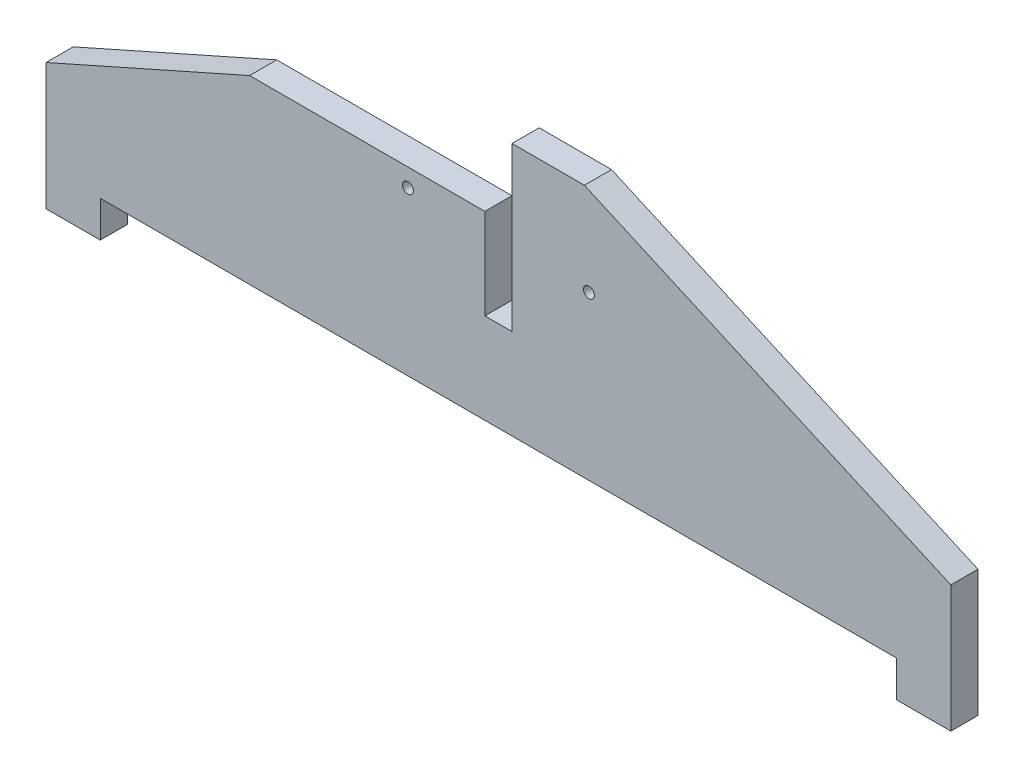
ISO-10303-21;
HEADER;
FILE_DESCRIPTION(('STEP AP214'),'2;1');
FILE_NAME('part.step','',(''),(''),'','','');
FILE_SCHEMA(('AUTOMOTIVE_DESIGN { 1 0 10303 214 1 1 1 1 }'));
ENDSEC;
DATA;
#1=APPLICATION_CONTEXT('core data for automotive mechanical design processes');
#2=APPLICATION_PROTOCOL_DEFINITION('international standard','automotive_design',2000,#1);
#3=PRODUCT_CONTEXT('',#1,'mechanical');
#4=PRODUCT('Part','Part','',(#3));
#5=PRODUCT_RELATED_PRODUCT_CATEGORY('part','',(#4));
#6=PRODUCT_DEFINITION_FORMATION('','',#4);
#7=PRODUCT_DEFINITION_CONTEXT('part definition',#1,'design');
#8=PRODUCT_DEFINITION('design','',#6,#7);
#9=PRODUCT_DEFINITION_SHAPE('','',#8);
#10=(LENGTH_UNIT() NAMED_UNIT(*) SI_UNIT(.MILLI.,.METRE.));
#11=(NAMED_UNIT(*) PLANE_ANGLE_UNIT() SI_UNIT($,.RADIAN.));
#12=(NAMED_UNIT(*) SI_UNIT($,.STERADIAN.) SOLID_ANGLE_UNIT());
#13=UNCERTAINTY_MEASURE_WITH_UNIT(LENGTH_MEASURE(1.E-05),#10,'distance_accuracy_value','');
#14=(GEOMETRIC_REPRESENTATION_CONTEXT(3) GLOBAL_UNCERTAINTY_ASSIGNED_CONTEXT((#13)) GLOBAL_UNIT_ASSIGNED_CONTEXT((#10,
#11,#12)) REPRESENTATION_CONTEXT('',''));
#15=CARTESIAN_POINT('',(0.,0.,0.));
#16=DIRECTION('',(0.,0.,1.));
#17=DIRECTION('',(1.,0.,0.));
#18=AXIS2_PLACEMENT_3D('',#15,#16,#17);
#19=CARTESIAN_POINT('',(0.,0.,15.));
#20=DIRECTION('',(0.,0.,1.));
#21=DIRECTION('',(1.,0.,0.));
#22=AXIS2_PLACEMENT_3D('',#19,#20,#21);
#23=PLANE('',#22);
#24=CARTESIAN_POINT('',(200.,110.,15.));
#25=DIRECTION('',(0.,0.,1.));
#26=DIRECTION('',(1.,0.,0.));
#27=AXIS2_PLACEMENT_3D('',#24,#25,#26);
#28=CIRCLE('',#27,2.99999999999999);
#29=CARTESIAN_POINT('',(203.,110.,15.));
#30=VERTEX_POINT('',#29);
#31=EDGE_CURVE('E182',#30,#30,#28,.T.);
#32=ORIENTED_EDGE('',*,*,#31,.F.);
#33=EDGE_LOOP('',(#32));
#34=FACE_BOUND('',#33,.T.);
#35=DIRECTION('',(0.,-1.,0.));
#36=VECTOR('',#35,1.);
#37=CARTESIAN_POINT('',(0.,70.,15.));
#38=LINE('',#37,#36);
#39=CARTESIAN_POINT('',(0.,70.,15.));
#40=VERTEX_POINT('',#39);
#41=CARTESIAN_POINT('',(0.,0.,15.));
#42=VERTEX_POINT('',#41);
#43=EDGE_CURVE('E218',#40,#42,#38,.T.);
#44=ORIENTED_EDGE('',*,*,#43,.T.);
#45=DIRECTION('',(1.,0.,0.));
#46=VECTOR('',#45,1.);
#47=CARTESIAN_POINT('',(0.,0.,15.));
#48=LINE('',#47,#46);
#49=CARTESIAN_POINT('',(30.,0.,15.));
#50=VERTEX_POINT('',#49);
#51=EDGE_CURVE('E118',#42,#50,#48,.T.);
#52=ORIENTED_EDGE('',*,*,#51,.T.);
#53=DIRECTION('',(0.,1.,0.));
#54=VECTOR('',#53,1.);
#55=CARTESIAN_POINT('',(30.,0.,15.));
#56=LINE('',#55,#54);
#57=CARTESIAN_POINT('',(30.,20.,15.));
#58=VERTEX_POINT('',#57);
#59=EDGE_CURVE('E263',#50,#58,#56,.T.);
#60=ORIENTED_EDGE('',*,*,#59,.T.);
#61=DIRECTION('',(1.,0.,0.));
#62=VECTOR('',#61,1.);
#63=CARTESIAN_POINT('',(30.,20.,15.));
#64=LINE('',#63,#62);
#65=CARTESIAN_POINT('',(470.,20.0000000000001,15.));
#66=VERTEX_POINT('',#65);
#67=EDGE_CURVE('E283',#58,#66,#64,.T.);
#68=ORIENTED_EDGE('',*,*,#67,.T.);
#69=DIRECTION('',(0.,-1.,0.));
#70=VECTOR('',#69,1.);
#71=CARTESIAN_POINT('',(470.,20.0000000000001,15.));
#72=LINE('',#71,#70);
#73=CARTESIAN_POINT('',(470.,0.,15.));
#74=VERTEX_POINT('',#73);
#75=EDGE_CURVE('E279',#66,#74,#72,.T.);
#76=ORIENTED_EDGE('',*,*,#75,.T.);
#77=DIRECTION('',(1.,0.,0.));
#78=VECTOR('',#77,1.);
#79=CARTESIAN_POINT('',(470.,0.,15.));
#80=LINE('',#79,#78);
#81=CARTESIAN_POINT('',(500.,0.,15.));
#82=VERTEX_POINT('',#81);
#83=EDGE_CURVE('E282',#74,#82,#80,.T.);
#84=ORIENTED_EDGE('',*,*,#83,.T.);
#85=DIRECTION('',(0.,1.,0.));
#86=VECTOR('',#85,1.);
#87=CARTESIAN_POINT('',(500.,0.,15.));
#88=LINE('',#87,#86);
#89=CARTESIAN_POINT('',(500.,70.0000000000001,15.));
#90=VERTEX_POINT('',#89);
#91=EDGE_CURVE('E287',#82,#90,#88,.T.);
#92=ORIENTED_EDGE('',*,*,#91,.T.);
#93=DIRECTION('',(-0.913811548620257,0.406138466053447,0.));
#94=VECTOR('',#93,1.);
#95=CARTESIAN_POINT('',(297.5,160.,15.));
#96=LINE('',#95,#94);
#97=CARTESIAN_POINT('',(297.5,160.,15.));
#98=VERTEX_POINT('',#97);
#99=EDGE_CURVE('E294',#90,#98,#96,.T.);
#100=ORIENTED_EDGE('',*,*,#99,.T.);
#101=DIRECTION('',(-1.,0.,0.));
#102=VECTOR('',#101,1.);
#103=CARTESIAN_POINT('',(257.5,160.,15.));
#104=LINE('',#103,#102);
#105=CARTESIAN_POINT('',(257.5,160.,15.));
#106=VERTEX_POINT('',#105);
#107=EDGE_CURVE('E297',#98,#106,#104,.T.);
#108=ORIENTED_EDGE('',*,*,#107,.T.);
#109=DIRECTION('',(0.,-1.,0.));
#110=VECTOR('',#109,1.);
#111=CARTESIAN_POINT('',(257.5,160.,15.));
#112=LINE('',#111,#110);
#113=CARTESIAN_POINT('',(257.5,70.,15.));
#114=VERTEX_POINT('',#113);
#115=EDGE_CURVE('E300',#106,#114,#112,.T.);
#116=ORIENTED_EDGE('',*,*,#115,.T.);
#117=DIRECTION('',(-1.,0.,0.));
#118=VECTOR('',#117,1.);
#119=CARTESIAN_POINT('',(257.5,70.,15.));
#120=LINE('',#119,#118);
#121=CARTESIAN_POINT('',(242.5,70.,15.));
#122=VERTEX_POINT('',#121);
#123=EDGE_CURVE('E155',#114,#122,#120,.T.);
#124=ORIENTED_EDGE('',*,*,#123,.T.);
#125=DIRECTION('',(0.,1.,0.));
#126=VECTOR('',#125,1.);
#127=CARTESIAN_POINT('',(242.5,70.,15.));
#128=LINE('',#127,#126);
#129=CARTESIAN_POINT('',(242.5,120.,15.));
#130=VERTEX_POINT('',#129);
#131=EDGE_CURVE('E149',#122,#130,#128,.T.);
#132=ORIENTED_EDGE('',*,*,#131,.T.);
#133=DIRECTION('',(-1.,0.,0.));
#134=VECTOR('',#133,1.);
#135=CARTESIAN_POINT('',(242.5,120.,15.));
#136=LINE('',#135,#134);
#137=CARTESIAN_POINT('',(112.5,120.,15.));
#138=VERTEX_POINT('',#137);
#139=EDGE_CURVE('E153',#130,#138,#136,.T.);
#140=ORIENTED_EDGE('',*,*,#139,.T.);
#141=DIRECTION('',(-0.913811548620257,-0.406138466053448,0.));
#142=VECTOR('',#141,1.);
#143=CARTESIAN_POINT('',(112.5,120.,15.));
#144=LINE('',#143,#142);
#145=EDGE_CURVE('E57',#138,#40,#144,.T.);
#146=ORIENTED_EDGE('',*,*,#145,.T.);
#147=EDGE_LOOP('',(#44,#52,#60,#68,#76,#84,#92,#100,#108,#116,#124,#132,#140,#146));
#148=FACE_BOUND('',#147,.T.);
#149=CARTESIAN_POINT('',(300.,110.,15.));
#150=DIRECTION('',(0.,0.,1.));
#151=DIRECTION('',(1.,0.,0.));
#152=AXIS2_PLACEMENT_3D('',#149,#150,#151);
#153=CIRCLE('',#152,2.99999999999999);
#154=CARTESIAN_POINT('',(303.,110.,15.));
#155=VERTEX_POINT('',#154);
#156=EDGE_CURVE('E344',#155,#155,#153,.T.);
#157=ORIENTED_EDGE('',*,*,#156,.F.);
#158=EDGE_LOOP('',(#157));
#159=FACE_BOUND('',#158,.T.);
#160=ADVANCED_FACE('F39',(#34,#148,#159),#23,.T.);
#161=CARTESIAN_POINT('',(0.,0.,0.));
#162=DIRECTION('',(0.,0.,1.));
#163=DIRECTION('',(1.,0.,0.));
#164=AXIS2_PLACEMENT_3D('',#161,#162,#163);
#165=PLANE('',#164);
#166=DIRECTION('',(0.,-1.,0.));
#167=VECTOR('',#166,1.);
#168=CARTESIAN_POINT('',(0.,70.,0.));
#169=LINE('',#168,#167);
#170=CARTESIAN_POINT('',(0.,70.,0.));
#171=VERTEX_POINT('',#170);
#172=CARTESIAN_POINT('',(0.,0.,0.));
#173=VERTEX_POINT('',#172);
#174=EDGE_CURVE('E177',#171,#173,#169,.T.);
#175=ORIENTED_EDGE('',*,*,#174,.F.);
#176=DIRECTION('',(-0.913811548620257,-0.406138466053448,0.));
#177=VECTOR('',#176,1.);
#178=CARTESIAN_POINT('',(112.5,120.,0.));
#179=LINE('',#178,#177);
#180=CARTESIAN_POINT('',(112.5,120.,0.));
#181=VERTEX_POINT('',#180);
#182=EDGE_CURVE('E110',#181,#171,#179,.T.);
#183=ORIENTED_EDGE('',*,*,#182,.F.);
#184=DIRECTION('',(-1.,0.,0.));
#185=VECTOR('',#184,1.);
#186=CARTESIAN_POINT('',(242.5,120.,0.));
#187=LINE('',#186,#185);
#188=CARTESIAN_POINT('',(242.5,120.,0.));
#189=VERTEX_POINT('',#188);
#190=EDGE_CURVE('E104',#189,#181,#187,.T.);
#191=ORIENTED_EDGE('',*,*,#190,.F.);
#192=DIRECTION('',(0.,1.,0.));
#193=VECTOR('',#192,1.);
#194=CARTESIAN_POINT('',(242.5,70.,0.));
#195=LINE('',#194,#193);
#196=CARTESIAN_POINT('',(242.5,70.,0.));
#197=VERTEX_POINT('',#196);
#198=EDGE_CURVE('E164',#197,#189,#195,.T.);
#199=ORIENTED_EDGE('',*,*,#198,.F.);
#200=DIRECTION('',(-1.,0.,0.));
#201=VECTOR('',#200,1.);
#202=CARTESIAN_POINT('',(257.5,70.,0.));
#203=LINE('',#202,#201);
#204=CARTESIAN_POINT('',(257.5,70.,0.));
#205=VERTEX_POINT('',#204);
#206=EDGE_CURVE('E209',#205,#197,#203,.T.);
#207=ORIENTED_EDGE('',*,*,#206,.F.);
#208=DIRECTION('',(0.,-1.,0.));
#209=VECTOR('',#208,1.);
#210=CARTESIAN_POINT('',(257.5,160.,0.));
#211=LINE('',#210,#209);
#212=CARTESIAN_POINT('',(257.5,160.,0.));
#213=VERTEX_POINT('',#212);
#214=EDGE_CURVE('E206',#213,#205,#211,.T.);
#215=ORIENTED_EDGE('',*,*,#214,.F.);
#216=DIRECTION('',(-1.,0.,0.));
#217=VECTOR('',#216,1.);
#218=CARTESIAN_POINT('',(257.5,160.,0.));
#219=LINE('',#218,#217);
#220=CARTESIAN_POINT('',(297.5,160.,0.));
#221=VERTEX_POINT('',#220);
#222=EDGE_CURVE('E203',#221,#213,#219,.T.);
#223=ORIENTED_EDGE('',*,*,#222,.F.);
#224=DIRECTION('',(-0.913811548620257,0.406138466053447,0.));
#225=VECTOR('',#224,1.);
#226=CARTESIAN_POINT('',(297.5,160.,0.));
#227=LINE('',#226,#225);
#228=CARTESIAN_POINT('',(500.,70.0000000000001,0.));
#229=VERTEX_POINT('',#228);
#230=EDGE_CURVE('E200',#229,#221,#227,.T.);
#231=ORIENTED_EDGE('',*,*,#230,.F.);
#232=DIRECTION('',(0.,1.,0.));
#233=VECTOR('',#232,1.);
#234=CARTESIAN_POINT('',(500.,0.,0.));
#235=LINE('',#234,#233);
#236=CARTESIAN_POINT('',(500.,0.,0.));
#237=VERTEX_POINT('',#236);
#238=EDGE_CURVE('E197',#237,#229,#235,.T.);
#239=ORIENTED_EDGE('',*,*,#238,.F.);
#240=DIRECTION('',(1.,0.,0.));
#241=VECTOR('',#240,1.);
#242=CARTESIAN_POINT('',(470.,0.,0.));
#243=LINE('',#242,#241);
#244=CARTESIAN_POINT('',(470.,0.,0.));
#245=VERTEX_POINT('',#244);
#246=EDGE_CURVE('E194',#245,#237,#243,.T.);
#247=ORIENTED_EDGE('',*,*,#246,.F.);
#248=DIRECTION('',(0.,-1.,0.));
#249=VECTOR('',#248,1.);
#250=CARTESIAN_POINT('',(470.,20.0000000000001,0.));
#251=LINE('',#250,#249);
#252=CARTESIAN_POINT('',(470.,20.0000000000001,0.));
#253=VERTEX_POINT('',#252);
#254=EDGE_CURVE('E191',#253,#245,#251,.T.);
#255=ORIENTED_EDGE('',*,*,#254,.F.);
#256=DIRECTION('',(1.,0.,0.));
#257=VECTOR('',#256,1.);
#258=CARTESIAN_POINT('',(30.,20.,0.));
#259=LINE('',#258,#257);
#260=CARTESIAN_POINT('',(30.,20.,0.));
#261=VERTEX_POINT('',#260);
#262=EDGE_CURVE('E188',#261,#253,#259,.T.);
#263=ORIENTED_EDGE('',*,*,#262,.F.);
#264=DIRECTION('',(0.,1.,0.));
#265=VECTOR('',#264,1.);
#266=CARTESIAN_POINT('',(30.,0.,0.));
#267=LINE('',#266,#265);
#268=CARTESIAN_POINT('',(30.,0.,0.));
#269=VERTEX_POINT('',#268);
#270=EDGE_CURVE('E185',#269,#261,#267,.T.);
#271=ORIENTED_EDGE('',*,*,#270,.F.);
#272=DIRECTION('',(1.,0.,0.));
#273=VECTOR('',#272,1.);
#274=CARTESIAN_POINT('',(0.,0.,0.));
#275=LINE('',#274,#273);
#276=EDGE_CURVE('E181',#173,#269,#275,.T.);
#277=ORIENTED_EDGE('',*,*,#276,.F.);
#278=EDGE_LOOP('',(#175,#183,#191,#199,#207,#215,#223,#231,#239,#247,#255,#263,#271,#277));
#279=FACE_BOUND('',#278,.T.);
#280=CARTESIAN_POINT('',(200.,110.,0.));
#281=DIRECTION('',(0.,0.,1.));
#282=DIRECTION('',(1.,0.,0.));
#283=AXIS2_PLACEMENT_3D('',#280,#281,#282);
#284=CIRCLE('',#283,2.99999999999999);
#285=CARTESIAN_POINT('',(203.,110.,0.));
#286=VERTEX_POINT('',#285);
#287=EDGE_CURVE('E352',#286,#286,#284,.T.);
#288=ORIENTED_EDGE('',*,*,#287,.T.);
#289=EDGE_LOOP('',(#288));
#290=FACE_BOUND('',#289,.T.);
#291=CARTESIAN_POINT('',(300.,110.,0.));
#292=DIRECTION('',(0.,0.,1.));
#293=DIRECTION('',(1.,0.,0.));
#294=AXIS2_PLACEMENT_3D('',#291,#292,#293);
#295=CIRCLE('',#294,2.99999999999999);
#296=CARTESIAN_POINT('',(303.,110.,0.));
#297=VERTEX_POINT('',#296);
#298=EDGE_CURVE('E347',#297,#297,#295,.T.);
#299=ORIENTED_EDGE('',*,*,#298,.T.);
#300=EDGE_LOOP('',(#299));
#301=FACE_BOUND('',#300,.T.);
#302=ADVANCED_FACE('F267',(#279,#290,#301),#165,.F.);
#303=CARTESIAN_POINT('',(0.,70.,15.));
#304=DIRECTION('',(1.,0.,0.));
#305=DIRECTION('',(0.,0.,-1.));
#306=AXIS2_PLACEMENT_3D('',#303,#304,#305);
#307=PLANE('',#306);
#308=ORIENTED_EDGE('',*,*,#174,.T.);
#309=DIRECTION('',(0.,0.,-1.));
#310=VECTOR('',#309,1.);
#311=CARTESIAN_POINT('',(0.,0.,15.));
#312=LINE('',#311,#310);
#313=EDGE_CURVE('E11',#42,#173,#312,.T.);
#314=ORIENTED_EDGE('',*,*,#313,.F.);
#315=ORIENTED_EDGE('',*,*,#43,.F.);
#316=DIRECTION('',(0.,0.,-1.));
#317=VECTOR('',#316,1.);
#318=CARTESIAN_POINT('',(0.,70.,15.));
#319=LINE('',#318,#317);
#320=EDGE_CURVE('E173',#40,#171,#319,.T.);
#321=ORIENTED_EDGE('',*,*,#320,.T.);
#322=EDGE_LOOP('',(#308,#314,#315,#321));
#323=FACE_BOUND('',#322,.T.);
#324=ADVANCED_FACE('F41',(#323),#307,.F.);
#325=CARTESIAN_POINT('',(0.,0.,15.));
#326=DIRECTION('',(0.,1.,0.));
#327=DIRECTION('',(0.,0.,1.));
#328=AXIS2_PLACEMENT_3D('',#325,#326,#327);
#329=PLANE('',#328);
#330=ORIENTED_EDGE('',*,*,#276,.T.);
#331=DIRECTION('',(0.,0.,-1.));
#332=VECTOR('',#331,1.);
#333=CARTESIAN_POINT('',(30.,0.,15.));
#334=LINE('',#333,#332);
#335=EDGE_CURVE('E49',#50,#269,#334,.T.);
#336=ORIENTED_EDGE('',*,*,#335,.F.);
#337=ORIENTED_EDGE('',*,*,#51,.F.);
#338=ORIENTED_EDGE('',*,*,#313,.T.);
#339=EDGE_LOOP('',(#330,#336,#337,#338));
#340=FACE_BOUND('',#339,.T.);
#341=ADVANCED_FACE('F470',(#340),#329,.F.);
#342=CARTESIAN_POINT('',(30.,0.,15.));
#343=DIRECTION('',(-1.,0.,0.));
#344=DIRECTION('',(0.,0.,1.));
#345=AXIS2_PLACEMENT_3D('',#342,#343,#344);
#346=PLANE('',#345);
#347=ORIENTED_EDGE('',*,*,#270,.T.);
#348=DIRECTION('',(0.,0.,-1.));
#349=VECTOR('',#348,1.);
#350=CARTESIAN_POINT('',(30.,20.,15.));
#351=LINE('',#350,#349);
#352=EDGE_CURVE('E253',#58,#261,#351,.T.);
#353=ORIENTED_EDGE('',*,*,#352,.F.);
#354=ORIENTED_EDGE('',*,*,#59,.F.);
#355=ORIENTED_EDGE('',*,*,#335,.T.);
#356=EDGE_LOOP('',(#347,#353,#354,#355));
#357=FACE_BOUND('',#356,.T.);
#358=ADVANCED_FACE('F261',(#357),#346,.F.);
#359=CARTESIAN_POINT('',(30.,20.,15.));
#360=DIRECTION('',(0.,1.,0.));
#361=DIRECTION('',(-1.,0.,0.));
#362=AXIS2_PLACEMENT_3D('',#359,#360,#361);
#363=PLANE('',#362);
#364=ORIENTED_EDGE('',*,*,#262,.T.);
#365=DIRECTION('',(0.,0.,-1.));
#366=VECTOR('',#365,1.);
#367=CARTESIAN_POINT('',(470.,20.0000000000001,15.));
#368=LINE('',#367,#366);
#369=EDGE_CURVE('E249',#66,#253,#368,.T.);
#370=ORIENTED_EDGE('',*,*,#369,.F.);
#371=ORIENTED_EDGE('',*,*,#67,.F.);
#372=ORIENTED_EDGE('',*,*,#352,.T.);
#373=EDGE_LOOP('',(#364,#370,#371,#372));
#374=FACE_BOUND('',#373,.T.);
#375=ADVANCED_FACE('F273',(#374),#363,.F.);
#376=CARTESIAN_POINT('',(470.,20.0000000000001,15.));
#377=DIRECTION('',(1.,0.,0.));
#378=DIRECTION('',(0.,0.,-1.));
#379=AXIS2_PLACEMENT_3D('',#376,#377,#378);
#380=PLANE('',#379);
#381=ORIENTED_EDGE('',*,*,#254,.T.);
#382=DIRECTION('',(0.,0.,-1.));
#383=VECTOR('',#382,1.);
#384=CARTESIAN_POINT('',(470.,0.,15.));
#385=LINE('',#384,#383);
#386=EDGE_CURVE('E245',#74,#245,#385,.T.);
#387=ORIENTED_EDGE('',*,*,#386,.F.);
#388=ORIENTED_EDGE('',*,*,#75,.F.);
#389=ORIENTED_EDGE('',*,*,#369,.T.);
#390=EDGE_LOOP('',(#381,#387,#388,#389));
#391=FACE_BOUND('',#390,.T.);
#392=ADVANCED_FACE('F277',(#391),#380,.F.);
#393=CARTESIAN_POINT('',(470.,0.,15.));
#394=DIRECTION('',(0.,1.,0.));
#395=DIRECTION('',(0.,0.,1.));
#396=AXIS2_PLACEMENT_3D('',#393,#394,#395);
#397=PLANE('',#396);
#398=ORIENTED_EDGE('',*,*,#246,.T.);
#399=DIRECTION('',(0.,0.,-1.));
#400=VECTOR('',#399,1.);
#401=CARTESIAN_POINT('',(500.,0.,15.));
#402=LINE('',#401,#400);
#403=EDGE_CURVE('E241',#82,#237,#402,.T.);
#404=ORIENTED_EDGE('',*,*,#403,.F.);
#405=ORIENTED_EDGE('',*,*,#83,.F.);
#406=ORIENTED_EDGE('',*,*,#386,.T.);
#407=EDGE_LOOP('',(#398,#404,#405,#406));
#408=FACE_BOUND('',#407,.T.);
#409=ADVANCED_FACE('F435',(#408),#397,.F.);
#410=CARTESIAN_POINT('',(500.,0.,15.));
#411=DIRECTION('',(-1.,0.,0.));
#412=DIRECTION('',(0.,0.,1.));
#413=AXIS2_PLACEMENT_3D('',#410,#411,#412);
#414=PLANE('',#413);
#415=ORIENTED_EDGE('',*,*,#238,.T.);
#416=DIRECTION('',(0.,0.,-1.));
#417=VECTOR('',#416,1.);
#418=CARTESIAN_POINT('',(500.,70.0000000000001,15.));
#419=LINE('',#418,#417);
#420=EDGE_CURVE('E237',#90,#229,#419,.T.);
#421=ORIENTED_EDGE('',*,*,#420,.F.);
#422=ORIENTED_EDGE('',*,*,#91,.F.);
#423=ORIENTED_EDGE('',*,*,#403,.T.);
#424=EDGE_LOOP('',(#415,#421,#422,#423));
#425=FACE_BOUND('',#424,.T.);
#426=ADVANCED_FACE('F425',(#425),#414,.F.);
#427=CARTESIAN_POINT('',(297.5,160.,15.));
#428=DIRECTION('',(-0.406138466053447,-0.913811548620257,0.));
#429=DIRECTION('',(0.913811548620257,-0.406138466053447,0.));
#430=AXIS2_PLACEMENT_3D('',#427,#428,#429);
#431=PLANE('',#430);
#432=ORIENTED_EDGE('',*,*,#230,.T.);
#433=DIRECTION('',(0.,0.,-1.));
#434=VECTOR('',#433,1.);
#435=CARTESIAN_POINT('',(297.5,160.,15.));
#436=LINE('',#435,#434);
#437=EDGE_CURVE('E233',#98,#221,#436,.T.);
#438=ORIENTED_EDGE('',*,*,#437,.F.);
#439=ORIENTED_EDGE('',*,*,#99,.F.);
#440=ORIENTED_EDGE('',*,*,#420,.T.);
#441=EDGE_LOOP('',(#432,#438,#439,#440));
#442=FACE_BOUND('',#441,.T.);
#443=ADVANCED_FACE('F415',(#442),#431,.F.);
#444=CARTESIAN_POINT('',(257.5,160.,15.));
#445=DIRECTION('',(0.,-1.,0.));
#446=DIRECTION('',(0.,0.,-1.));
#447=AXIS2_PLACEMENT_3D('',#444,#445,#446);
#448=PLANE('',#447);
#449=ORIENTED_EDGE('',*,*,#222,.T.);
#450=DIRECTION('',(0.,0.,-1.));
#451=VECTOR('',#450,1.);
#452=CARTESIAN_POINT('',(257.5,160.,15.));
#453=LINE('',#452,#451);
#454=EDGE_CURVE('E229',#106,#213,#453,.T.);
#455=ORIENTED_EDGE('',*,*,#454,.F.);
#456=ORIENTED_EDGE('',*,*,#107,.F.);
#457=ORIENTED_EDGE('',*,*,#437,.T.);
#458=EDGE_LOOP('',(#449,#455,#456,#457));
#459=FACE_BOUND('',#458,.T.);
#460=ADVANCED_FACE('F406',(#459),#448,.F.);
#461=CARTESIAN_POINT('',(257.5,160.,15.));
#462=DIRECTION('',(1.,0.,0.));
#463=DIRECTION('',(0.,0.,-1.));
#464=AXIS2_PLACEMENT_3D('',#461,#462,#463);
#465=PLANE('',#464);
#466=ORIENTED_EDGE('',*,*,#214,.T.);
#467=DIRECTION('',(0.,0.,-1.));
#468=VECTOR('',#467,1.);
#469=CARTESIAN_POINT('',(257.5,70.,15.));
#470=LINE('',#469,#468);
#471=EDGE_CURVE('E225',#114,#205,#470,.T.);
#472=ORIENTED_EDGE('',*,*,#471,.F.);
#473=ORIENTED_EDGE('',*,*,#115,.F.);
#474=ORIENTED_EDGE('',*,*,#454,.T.);
#475=EDGE_LOOP('',(#466,#472,#473,#474));
#476=FACE_BOUND('',#475,.T.);
#477=ADVANCED_FACE('F308',(#476),#465,.F.);
#478=CARTESIAN_POINT('',(257.5,70.,15.));
#479=DIRECTION('',(0.,-1.,0.));
#480=DIRECTION('',(0.,0.,-1.));
#481=AXIS2_PLACEMENT_3D('',#478,#479,#480);
#482=PLANE('',#481);
#483=ORIENTED_EDGE('',*,*,#206,.T.);
#484=DIRECTION('',(0.,0.,-1.));
#485=VECTOR('',#484,1.);
#486=CARTESIAN_POINT('',(242.5,70.,15.));
#487=LINE('',#486,#485);
#488=EDGE_CURVE('E166',#122,#197,#487,.T.);
#489=ORIENTED_EDGE('',*,*,#488,.F.);
#490=ORIENTED_EDGE('',*,*,#123,.F.);
#491=ORIENTED_EDGE('',*,*,#471,.T.);
#492=EDGE_LOOP('',(#483,#489,#490,#491));
#493=FACE_BOUND('',#492,.T.);
#494=ADVANCED_FACE('F312',(#493),#482,.F.);
#495=CARTESIAN_POINT('',(242.5,70.,15.));
#496=DIRECTION('',(-1.,0.,0.));
#497=DIRECTION('',(0.,0.,1.));
#498=AXIS2_PLACEMENT_3D('',#495,#496,#497);
#499=PLANE('',#498);
#500=ORIENTED_EDGE('',*,*,#198,.T.);
#501=DIRECTION('',(0.,0.,-1.));
#502=VECTOR('',#501,1.);
#503=CARTESIAN_POINT('',(242.5,120.,15.));
#504=LINE('',#503,#502);
#505=EDGE_CURVE('E161',#130,#189,#504,.T.);
#506=ORIENTED_EDGE('',*,*,#505,.F.);
#507=ORIENTED_EDGE('',*,*,#131,.F.);
#508=ORIENTED_EDGE('',*,*,#488,.T.);
#509=EDGE_LOOP('',(#500,#506,#507,#508));
#510=FACE_BOUND('',#509,.T.);
#511=ADVANCED_FACE('F162',(#510),#499,.F.);
#512=CARTESIAN_POINT('',(242.5,120.,15.));
#513=DIRECTION('',(0.,-1.,0.));
#514=DIRECTION('',(1.,0.,0.));
#515=AXIS2_PLACEMENT_3D('',#512,#513,#514);
#516=PLANE('',#515);
#517=ORIENTED_EDGE('',*,*,#190,.T.);
#518=DIRECTION('',(0.,0.,-1.));
#519=VECTOR('',#518,1.);
#520=CARTESIAN_POINT('',(112.5,120.,15.));
#521=LINE('',#520,#519);
#522=EDGE_CURVE('E167',#138,#181,#521,.T.);
#523=ORIENTED_EDGE('',*,*,#522,.F.);
#524=ORIENTED_EDGE('',*,*,#139,.F.);
#525=ORIENTED_EDGE('',*,*,#505,.T.);
#526=EDGE_LOOP('',(#517,#523,#524,#525));
#527=FACE_BOUND('',#526,.T.);
#528=ADVANCED_FACE('F169',(#527),#516,.F.);
#529=CARTESIAN_POINT('',(112.5,120.,15.));
#530=DIRECTION('',(0.406138466053448,-0.913811548620257,0.));
#531=DIRECTION('',(0.913811548620257,0.406138466053448,0.));
#532=AXIS2_PLACEMENT_3D('',#529,#530,#531);
#533=PLANE('',#532);
#534=ORIENTED_EDGE('',*,*,#182,.T.);
#535=ORIENTED_EDGE('',*,*,#320,.F.);
#536=ORIENTED_EDGE('',*,*,#145,.F.);
#537=ORIENTED_EDGE('',*,*,#522,.T.);
#538=EDGE_LOOP('',(#534,#535,#536,#537));
#539=FACE_BOUND('',#538,.T.);
#540=ADVANCED_FACE('F316',(#539),#533,.F.);
#541=CARTESIAN_POINT('',(200.,110.,15.));
#542=DIRECTION('',(0.,0.,-1.));
#543=DIRECTION('',(-1.,0.,0.));
#544=AXIS2_PLACEMENT_3D('',#541,#542,#543);
#545=CYLINDRICAL_SURFACE('',#544,2.99999999999999);
#546=ORIENTED_EDGE('',*,*,#31,.T.);
#547=EDGE_LOOP('',(#546));
#548=FACE_BOUND('',#547,.T.);
#549=ORIENTED_EDGE('',*,*,#287,.F.);
#550=EDGE_LOOP('',(#549));
#551=FACE_BOUND('',#550,.T.);
#552=ADVANCED_FACE('F318',(#548,#551),#545,.F.);
#553=CARTESIAN_POINT('',(300.,110.,15.));
#554=DIRECTION('',(0.,0.,-1.));
#555=DIRECTION('',(-1.,0.,0.));
#556=AXIS2_PLACEMENT_3D('',#553,#554,#555);
#557=CYLINDRICAL_SURFACE('',#556,2.99999999999999);
#558=ORIENTED_EDGE('',*,*,#156,.T.);
#559=EDGE_LOOP('',(#558));
#560=FACE_BOUND('',#559,.T.);
#561=ORIENTED_EDGE('',*,*,#298,.F.);
#562=EDGE_LOOP('',(#561));
#563=FACE_BOUND('',#562,.T.);
#564=ADVANCED_FACE('F324',(#560,#563),#557,.F.);
#565=CLOSED_SHELL('',(#160,#302,#324,#341,#358,#375,#392,#409,#426,#443,#460,#477,#494,#511,
#528,#540,#552,#564));
#566=MANIFOLD_SOLID_BREP('B2',#565);
#567=ADVANCED_BREP_SHAPE_REPRESENTATION('',(#18,#566),#14);
#568=SHAPE_DEFINITION_REPRESENTATION(#9,#567);
ENDSEC;
END-ISO-10303-21;
